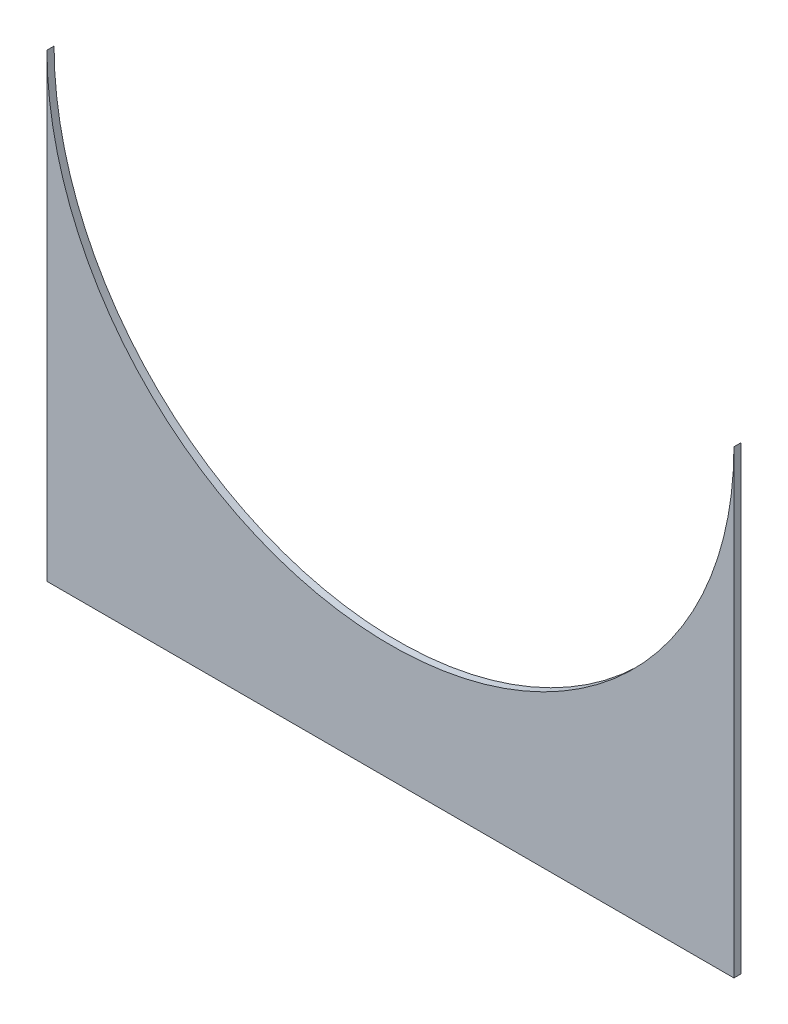
ISO-10303-21;
HEADER;
FILE_DESCRIPTION(('STEP AP214'),'2;1');
FILE_NAME('part.step','',(''),(''),'','','');
FILE_SCHEMA(('AUTOMOTIVE_DESIGN { 1 0 10303 214 1 1 1 1 }'));
ENDSEC;
DATA;
#1=APPLICATION_CONTEXT('core data for automotive mechanical design processes');
#2=APPLICATION_PROTOCOL_DEFINITION('international standard','automotive_design',2000,#1);
#3=PRODUCT_CONTEXT('',#1,'mechanical');
#4=PRODUCT('Part','Part','',(#3));
#5=PRODUCT_RELATED_PRODUCT_CATEGORY('part','',(#4));
#6=PRODUCT_DEFINITION_FORMATION('','',#4);
#7=PRODUCT_DEFINITION_CONTEXT('part definition',#1,'design');
#8=PRODUCT_DEFINITION('design','',#6,#7);
#9=PRODUCT_DEFINITION_SHAPE('','',#8);
#10=(LENGTH_UNIT() NAMED_UNIT(*) SI_UNIT(.MILLI.,.METRE.));
#11=(NAMED_UNIT(*) PLANE_ANGLE_UNIT() SI_UNIT($,.RADIAN.));
#12=(NAMED_UNIT(*) SI_UNIT($,.STERADIAN.) SOLID_ANGLE_UNIT());
#13=UNCERTAINTY_MEASURE_WITH_UNIT(LENGTH_MEASURE(1.E-05),#10,'distance_accuracy_value','');
#14=(GEOMETRIC_REPRESENTATION_CONTEXT(3) GLOBAL_UNCERTAINTY_ASSIGNED_CONTEXT((#13)) GLOBAL_UNIT_ASSIGNED_CONTEXT((#10,
#11,#12)) REPRESENTATION_CONTEXT('',''));
#15=CARTESIAN_POINT('',(0.,0.,0.));
#16=DIRECTION('',(0.,0.,1.));
#17=DIRECTION('',(1.,0.,0.));
#18=AXIS2_PLACEMENT_3D('',#15,#16,#17);
#19=CARTESIAN_POINT('',(3240.,3400.,-130.));
#20=DIRECTION('',(0.,0.,1.));
#21=DIRECTION('',(1.,0.,0.));
#22=AXIS2_PLACEMENT_3D('',#19,#20,#21);
#23=PLANE('',#22);
#24=DIRECTION('',(1.,0.,0.));
#25=VECTOR('',#24,1.);
#26=CARTESIAN_POINT('',(1010.,2107.5,-130.));
#27=LINE('',#26,#25);
#28=CARTESIAN_POINT('',(1310.19566711814,2107.5,-130.));
#29=VERTEX_POINT('',#28);
#30=CARTESIAN_POINT('',(3240.,2107.5,-130.));
#31=VERTEX_POINT('',#30);
#32=EDGE_CURVE('E120',#29,#31,#27,.T.);
#33=ORIENTED_EDGE('',*,*,#32,.T.);
#34=DIRECTION('',(0.,-1.,0.));
#35=VECTOR('',#34,1.);
#36=CARTESIAN_POINT('',(3240.,3400.,-130.));
#37=LINE('',#36,#35);
#38=CARTESIAN_POINT('',(3240.,3400.,-130.));
#39=VERTEX_POINT('',#38);
#40=EDGE_CURVE('E119',#39,#31,#37,.T.);
#41=ORIENTED_EDGE('',*,*,#40,.F.);
#42=CARTESIAN_POINT('',(2275.,3400.,-130.));
#43=DIRECTION('',(0.,0.,1.));
#44=DIRECTION('',(-1.,0.,0.));
#45=AXIS2_PLACEMENT_3D('',#42,#43,#44);
#46=CIRCLE('',#45,965.);
#47=CARTESIAN_POINT('',(1310.,3400.,-130.));
#48=VERTEX_POINT('',#47);
#49=EDGE_CURVE('E108',#48,#39,#46,.T.);
#50=ORIENTED_EDGE('',*,*,#49,.F.);
#51=DIRECTION('',(0.,1.,0.));
#52=VECTOR('',#51,1.);
#53=CARTESIAN_POINT('',(1310.,2407.5,-130.));
#54=LINE('',#53,#52);
#55=CARTESIAN_POINT('',(1310.,2407.5,-130.));
#56=VERTEX_POINT('',#55);
#57=EDGE_CURVE('E104',#56,#48,#54,.T.);
#58=ORIENTED_EDGE('',*,*,#57,.F.);
#59=DIRECTION('',(-1.,0.,0.));
#60=VECTOR('',#59,1.);
#61=CARTESIAN_POINT('',(3240.,2407.5,-130.));
#62=LINE('',#61,#60);
#63=CARTESIAN_POINT('',(1310.19566711814,2407.5,-130.));
#64=VERTEX_POINT('',#63);
#65=EDGE_CURVE('E96',#64,#56,#62,.T.);
#66=ORIENTED_EDGE('',*,*,#65,.F.);
#67=DIRECTION('',(0.,-1.,0.));
#68=VECTOR('',#67,1.);
#69=CARTESIAN_POINT('',(1310.19566711814,175.598148660339,-130.));
#70=LINE('',#69,#68);
#71=EDGE_CURVE('E100',#64,#29,#70,.T.);
#72=ORIENTED_EDGE('',*,*,#71,.T.);
#73=EDGE_LOOP('',(#33,#41,#50,#58,#66,#72));
#74=FACE_BOUND('',#73,.T.);
#75=ADVANCED_FACE('F38',(#74),#23,.T.);
#76=CARTESIAN_POINT('',(1310.,7180.,150.000000000003));
#77=DIRECTION('',(1.,0.,0.));
#78=DIRECTION('',(0.,0.,-1.));
#79=AXIS2_PLACEMENT_3D('',#76,#77,#78);
#80=PLANE('',#79);
#81=DIRECTION('',(0.,0.,-1.));
#82=VECTOR('',#81,1.);
#83=CARTESIAN_POINT('',(1310.,2407.5,-130.));
#84=LINE('',#83,#82);
#85=CARTESIAN_POINT('',(1310.,2407.5,-150.));
#86=VERTEX_POINT('',#85);
#87=EDGE_CURVE('E148',#56,#86,#84,.T.);
#88=ORIENTED_EDGE('',*,*,#87,.F.);
#89=ORIENTED_EDGE('',*,*,#57,.T.);
#90=DIRECTION('',(0.,0.,-1.));
#91=VECTOR('',#90,1.);
#92=CARTESIAN_POINT('',(1310.,3400.,-130.));
#93=LINE('',#92,#91);
#94=CARTESIAN_POINT('',(1310.,3400.,-150.));
#95=VERTEX_POINT('',#94);
#96=EDGE_CURVE('E140',#48,#95,#93,.T.);
#97=ORIENTED_EDGE('',*,*,#96,.T.);
#98=DIRECTION('',(0.,1.,0.));
#99=VECTOR('',#98,1.);
#100=CARTESIAN_POINT('',(1310.,2347.5,-150.));
#101=LINE('',#100,#99);
#102=EDGE_CURVE('E55',#86,#95,#101,.T.);
#103=ORIENTED_EDGE('',*,*,#102,.F.);
#104=EDGE_LOOP('',(#88,#89,#97,#103));
#105=FACE_BOUND('',#104,.T.);
#106=ADVANCED_FACE('F170',(#105),#80,.F.);
#107=CARTESIAN_POINT('',(3240.,2407.5,-130.));
#108=DIRECTION('',(0.,-1.,0.));
#109=DIRECTION('',(0.,0.,-1.));
#110=AXIS2_PLACEMENT_3D('',#107,#108,#109);
#111=PLANE('',#110);
#112=DIRECTION('',(-1.,0.,0.));
#113=VECTOR('',#112,1.);
#114=CARTESIAN_POINT('',(3240.,2407.5,-150.));
#115=LINE('',#114,#113);
#116=CARTESIAN_POINT('',(1310.19566711814,2407.5,-150.));
#117=VERTEX_POINT('',#116);
#118=EDGE_CURVE('E112',#117,#86,#115,.T.);
#119=ORIENTED_EDGE('',*,*,#118,.F.);
#120=DIRECTION('',(0.,0.,-1.));
#121=VECTOR('',#120,1.);
#122=CARTESIAN_POINT('',(1310.19566711814,2407.5,-150.));
#123=LINE('',#122,#121);
#124=EDGE_CURVE('E42',#64,#117,#123,.T.);
#125=ORIENTED_EDGE('',*,*,#124,.F.);
#126=ORIENTED_EDGE('',*,*,#65,.T.);
#127=ORIENTED_EDGE('',*,*,#87,.T.);
#128=EDGE_LOOP('',(#119,#125,#126,#127));
#129=FACE_BOUND('',#128,.T.);
#130=ADVANCED_FACE('F110',(#129),#111,.T.);
#131=CARTESIAN_POINT('',(2275.,3400.,-130.));
#132=DIRECTION('',(0.,0.,-1.));
#133=DIRECTION('',(-1.,0.,0.));
#134=AXIS2_PLACEMENT_3D('',#131,#132,#133);
#135=CYLINDRICAL_SURFACE('',#134,965.);
#136=CARTESIAN_POINT('',(2275.,3400.,-150.));
#137=DIRECTION('',(0.,0.,1.));
#138=DIRECTION('',(-1.,0.,0.));
#139=AXIS2_PLACEMENT_3D('',#136,#137,#138);
#140=CIRCLE('',#139,965.);
#141=CARTESIAN_POINT('',(3240.,3400.,-150.));
#142=VERTEX_POINT('',#141);
#143=EDGE_CURVE('E107',#95,#142,#140,.T.);
#144=ORIENTED_EDGE('',*,*,#143,.F.);
#145=ORIENTED_EDGE('',*,*,#96,.F.);
#146=ORIENTED_EDGE('',*,*,#49,.T.);
#147=DIRECTION('',(0.,0.,-1.));
#148=VECTOR('',#147,1.);
#149=CARTESIAN_POINT('',(3240.,3400.,-130.));
#150=LINE('',#149,#148);
#151=EDGE_CURVE('E63',#39,#142,#150,.T.);
#152=ORIENTED_EDGE('',*,*,#151,.T.);
#153=EDGE_LOOP('',(#144,#145,#146,#152));
#154=FACE_BOUND('',#153,.T.);
#155=ADVANCED_FACE('F177',(#154),#135,.F.);
#156=CARTESIAN_POINT('',(3240.,2107.5,-60.));
#157=DIRECTION('',(-1.,0.,0.));
#158=DIRECTION('',(0.,0.,1.));
#159=AXIS2_PLACEMENT_3D('',#156,#157,#158);
#160=PLANE('',#159);
#161=ORIENTED_EDGE('',*,*,#40,.T.);
#162=DIRECTION('',(0.,0.,1.));
#163=VECTOR('',#162,1.);
#164=CARTESIAN_POINT('',(3240.,2107.5,150.));
#165=LINE('',#164,#163);
#166=CARTESIAN_POINT('',(3240.,2107.5,-150.));
#167=VERTEX_POINT('',#166);
#168=EDGE_CURVE('E124',#167,#31,#165,.T.);
#169=ORIENTED_EDGE('',*,*,#168,.F.);
#170=DIRECTION('',(0.,-1.,0.));
#171=VECTOR('',#170,1.);
#172=CARTESIAN_POINT('',(3240.,2347.5,-150.));
#173=LINE('',#172,#171);
#174=EDGE_CURVE('E131',#142,#167,#173,.T.);
#175=ORIENTED_EDGE('',*,*,#174,.F.);
#176=ORIENTED_EDGE('',*,*,#151,.F.);
#177=EDGE_LOOP('',(#161,#169,#175,#176));
#178=FACE_BOUND('',#177,.T.);
#179=ADVANCED_FACE('F164',(#178),#160,.F.);
#180=CARTESIAN_POINT('',(160.,2347.5,-150.));
#181=DIRECTION('',(0.,0.,1.));
#182=DIRECTION('',(1.,0.,0.));
#183=AXIS2_PLACEMENT_3D('',#180,#181,#182);
#184=PLANE('',#183);
#185=ORIENTED_EDGE('',*,*,#143,.T.);
#186=ORIENTED_EDGE('',*,*,#174,.T.);
#187=DIRECTION('',(-1.,0.,0.));
#188=VECTOR('',#187,1.);
#189=CARTESIAN_POINT('',(160.,2107.5,-150.));
#190=LINE('',#189,#188);
#191=CARTESIAN_POINT('',(1310.19566711814,2107.5,-150.));
#192=VERTEX_POINT('',#191);
#193=EDGE_CURVE('E133',#167,#192,#190,.T.);
#194=ORIENTED_EDGE('',*,*,#193,.T.);
#195=DIRECTION('',(0.,1.,0.));
#196=VECTOR('',#195,1.);
#197=CARTESIAN_POINT('',(1310.19566711814,175.598148660339,-150.));
#198=LINE('',#197,#196);
#199=EDGE_CURVE('E11',#192,#117,#198,.T.);
#200=ORIENTED_EDGE('',*,*,#199,.T.);
#201=ORIENTED_EDGE('',*,*,#118,.T.);
#202=ORIENTED_EDGE('',*,*,#102,.T.);
#203=EDGE_LOOP('',(#185,#186,#194,#200,#201,#202));
#204=FACE_BOUND('',#203,.T.);
#205=ADVANCED_FACE('F162',(#204),#184,.F.);
#206=CARTESIAN_POINT('',(1310.19566711814,175.598148660339,-150.));
#207=DIRECTION('',(1.,0.,0.));
#208=DIRECTION('',(0.,0.,-1.));
#209=AXIS2_PLACEMENT_3D('',#206,#207,#208);
#210=PLANE('',#209);
#211=ORIENTED_EDGE('',*,*,#71,.F.);
#212=ORIENTED_EDGE('',*,*,#124,.T.);
#213=ORIENTED_EDGE('',*,*,#199,.F.);
#214=DIRECTION('',(0.,0.,-1.));
#215=VECTOR('',#214,1.);
#216=CARTESIAN_POINT('',(1310.19566711814,2107.5,-149.999999999997));
#217=LINE('',#216,#215);
#218=EDGE_CURVE('E117',#29,#192,#217,.T.);
#219=ORIENTED_EDGE('',*,*,#218,.F.);
#220=EDGE_LOOP('',(#211,#212,#213,#219));
#221=FACE_BOUND('',#220,.T.);
#222=ADVANCED_FACE('F116',(#221),#210,.F.);
#223=CARTESIAN_POINT('',(1010.,2107.5,150.));
#224=DIRECTION('',(0.,1.,0.));
#225=DIRECTION('',(0.,0.,1.));
#226=AXIS2_PLACEMENT_3D('',#223,#224,#225);
#227=PLANE('',#226);
#228=ORIENTED_EDGE('',*,*,#32,.F.);
#229=ORIENTED_EDGE('',*,*,#218,.T.);
#230=ORIENTED_EDGE('',*,*,#193,.F.);
#231=ORIENTED_EDGE('',*,*,#168,.T.);
#232=EDGE_LOOP('',(#228,#229,#230,#231));
#233=FACE_BOUND('',#232,.T.);
#234=ADVANCED_FACE('F40',(#233),#227,.F.);
#235=CLOSED_SHELL('',(#75,#106,#130,#155,#179,#205,#222,#234));
#236=MANIFOLD_SOLID_BREP('B2',#235);
#237=ADVANCED_BREP_SHAPE_REPRESENTATION('',(#18,#236),#14);
#238=SHAPE_DEFINITION_REPRESENTATION(#9,#237);
ENDSEC;
END-ISO-10303-21;
